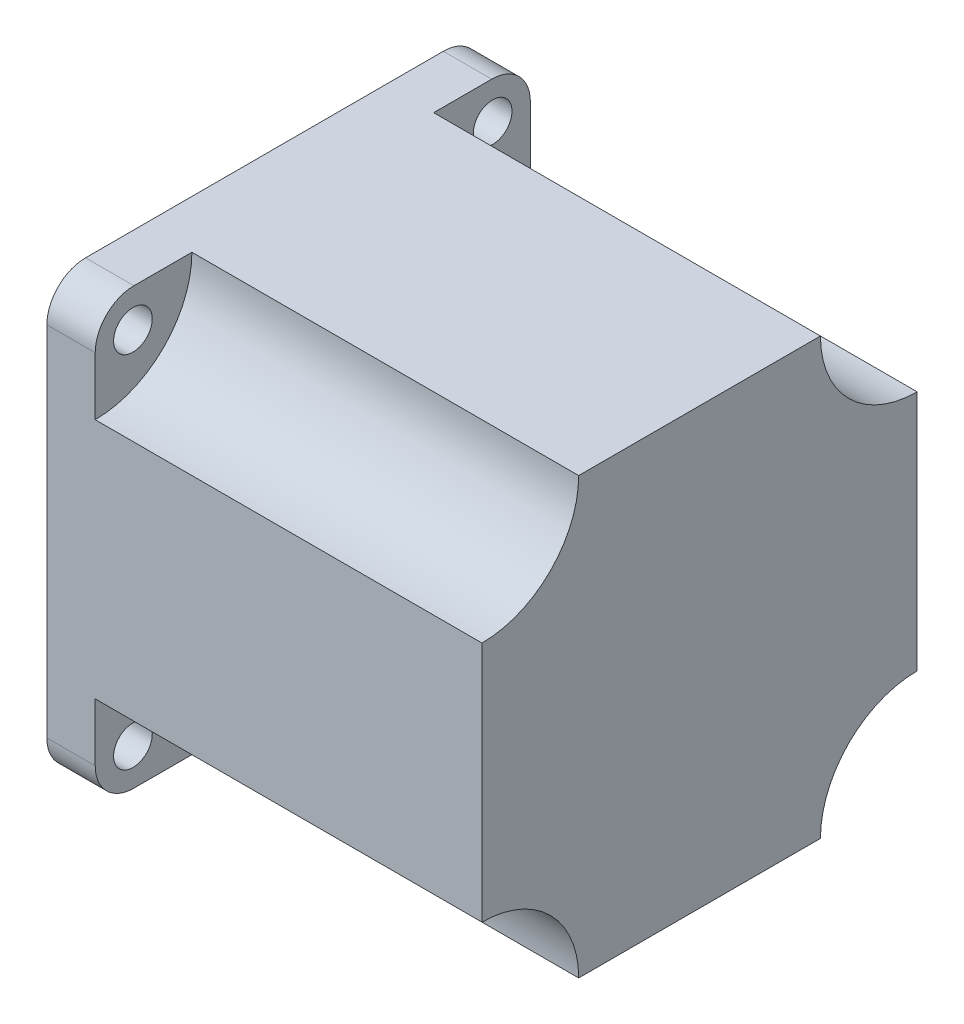
ISO-10303-21;
HEADER;
FILE_DESCRIPTION(('STEP AP214'),'2;1');
FILE_NAME('part.step','',(''),(''),'','','');
FILE_SCHEMA(('AUTOMOTIVE_DESIGN { 1 0 10303 214 1 1 1 1 }'));
ENDSEC;
DATA;
#1=APPLICATION_CONTEXT('core data for automotive mechanical design processes');
#2=APPLICATION_PROTOCOL_DEFINITION('international standard','automotive_design',2000,#1);
#3=PRODUCT_CONTEXT('',#1,'mechanical');
#4=PRODUCT('Part','Part','',(#3));
#5=PRODUCT_RELATED_PRODUCT_CATEGORY('part','',(#4));
#6=PRODUCT_DEFINITION_FORMATION('','',#4);
#7=PRODUCT_DEFINITION_CONTEXT('part definition',#1,'design');
#8=PRODUCT_DEFINITION('design','',#6,#7);
#9=PRODUCT_DEFINITION_SHAPE('','',#8);
#10=(LENGTH_UNIT() NAMED_UNIT(*) SI_UNIT(.MILLI.,.METRE.));
#11=(NAMED_UNIT(*) PLANE_ANGLE_UNIT() SI_UNIT($,.RADIAN.));
#12=(NAMED_UNIT(*) SI_UNIT($,.STERADIAN.) SOLID_ANGLE_UNIT());
#13=UNCERTAINTY_MEASURE_WITH_UNIT(LENGTH_MEASURE(1.E-05),#10,'distance_accuracy_value','');
#14=(GEOMETRIC_REPRESENTATION_CONTEXT(3) GLOBAL_UNCERTAINTY_ASSIGNED_CONTEXT((#13)) GLOBAL_UNIT_ASSIGNED_CONTEXT((#10,
#11,#12)) REPRESENTATION_CONTEXT('',''));
#15=CARTESIAN_POINT('',(0.,0.,0.));
#16=DIRECTION('',(0.,0.,1.));
#17=DIRECTION('',(1.,0.,0.));
#18=AXIS2_PLACEMENT_3D('',#15,#16,#17);
#19=CARTESIAN_POINT('',(6.35,0.,0.));
#20=DIRECTION('',(-1.,0.,0.));
#21=DIRECTION('',(0.,0.,1.));
#22=AXIS2_PLACEMENT_3D('',#19,#20,#21);
#23=PLANE('',#22);
#24=CARTESIAN_POINT('',(6.35,23.622,23.622));
#25=DIRECTION('',(1.,0.,0.));
#26=DIRECTION('',(0.,0.,-1.));
#27=AXIS2_PLACEMENT_3D('',#24,#25,#26);
#28=CIRCLE('',#27,2.54);
#29=CARTESIAN_POINT('',(6.35,23.622,21.082));
#30=VERTEX_POINT('',#29);
#31=EDGE_CURVE('E322',#30,#30,#28,.T.);
#32=ORIENTED_EDGE('',*,*,#31,.F.);
#33=EDGE_LOOP('',(#32));
#34=FACE_BOUND('',#33,.T.);
#35=DIRECTION('',(0.,-1.,0.));
#36=VECTOR('',#35,1.);
#37=CARTESIAN_POINT('',(6.35,28.575,28.575));
#38=LINE('',#37,#36);
#39=CARTESIAN_POINT('',(6.35,23.495,28.575));
#40=VERTEX_POINT('',#39);
#41=CARTESIAN_POINT('',(6.35,15.875,28.575));
#42=VERTEX_POINT('',#41);
#43=EDGE_CURVE('E273',#40,#42,#38,.T.);
#44=ORIENTED_EDGE('',*,*,#43,.T.);
#45=CARTESIAN_POINT('',(6.35,28.575,28.575));
#46=DIRECTION('',(1.,0.,0.));
#47=DIRECTION('',(0.,0.,-1.));
#48=AXIS2_PLACEMENT_3D('',#45,#46,#47);
#49=CIRCLE('',#48,12.7);
#50=CARTESIAN_POINT('',(6.35,28.575,15.875));
#51=VERTEX_POINT('',#50);
#52=EDGE_CURVE('E164',#42,#51,#49,.T.);
#53=ORIENTED_EDGE('',*,*,#52,.T.);
#54=DIRECTION('',(0.,0.,1.));
#55=VECTOR('',#54,1.);
#56=CARTESIAN_POINT('',(6.35,28.575,-28.575));
#57=LINE('',#56,#55);
#58=CARTESIAN_POINT('',(6.35,28.575,23.495));
#59=VERTEX_POINT('',#58);
#60=EDGE_CURVE('E66',#51,#59,#57,.T.);
#61=ORIENTED_EDGE('',*,*,#60,.T.);
#62=CARTESIAN_POINT('',(6.35,23.495,23.495));
#63=DIRECTION('',(-1.,0.,0.));
#64=DIRECTION('',(0.,0.,1.));
#65=AXIS2_PLACEMENT_3D('',#62,#63,#64);
#66=CIRCLE('',#65,5.08);
#67=EDGE_CURVE('E628',#59,#40,#66,.F.);
#68=ORIENTED_EDGE('',*,*,#67,.T.);
#69=EDGE_LOOP('',(#44,#53,#61,#68));
#70=FACE_BOUND('',#69,.T.);
#71=ADVANCED_FACE('F41',(#34,#70),#23,.F.);
#72=CARTESIAN_POINT('',(6.35,23.622,-23.622));
#73=DIRECTION('',(1.,0.,0.));
#74=DIRECTION('',(0.,0.,-1.));
#75=AXIS2_PLACEMENT_3D('',#72,#73,#74);
#76=CIRCLE('',#75,2.54);
#77=CARTESIAN_POINT('',(6.35,23.622,-26.162));
#78=VERTEX_POINT('',#77);
#79=EDGE_CURVE('E328',#78,#78,#76,.T.);
#80=ORIENTED_EDGE('',*,*,#79,.F.);
#81=EDGE_LOOP('',(#80));
#82=FACE_BOUND('',#81,.T.);
#83=CARTESIAN_POINT('',(6.35,28.575,-23.495));
#84=VERTEX_POINT('',#83);
#85=CARTESIAN_POINT('',(6.35,28.575,-15.875));
#86=VERTEX_POINT('',#85);
#87=EDGE_CURVE('E293',#84,#86,#57,.T.);
#88=ORIENTED_EDGE('',*,*,#87,.T.);
#89=CARTESIAN_POINT('',(6.35,28.575,-28.575));
#90=DIRECTION('',(1.,0.,0.));
#91=DIRECTION('',(0.,0.,-1.));
#92=AXIS2_PLACEMENT_3D('',#89,#90,#91);
#93=CIRCLE('',#92,12.7);
#94=CARTESIAN_POINT('',(6.35,15.875,-28.575));
#95=VERTEX_POINT('',#94);
#96=EDGE_CURVE('E210',#86,#95,#93,.T.);
#97=ORIENTED_EDGE('',*,*,#96,.T.);
#98=DIRECTION('',(0.,1.,0.));
#99=VECTOR('',#98,1.);
#100=CARTESIAN_POINT('',(6.35,28.575,-28.575));
#101=LINE('',#100,#99);
#102=CARTESIAN_POINT('',(6.35,23.495,-28.575));
#103=VERTEX_POINT('',#102);
#104=EDGE_CURVE('E277',#95,#103,#101,.T.);
#105=ORIENTED_EDGE('',*,*,#104,.T.);
#106=CARTESIAN_POINT('',(6.35,23.495,-23.495));
#107=DIRECTION('',(-1.,0.,0.));
#108=DIRECTION('',(0.,0.,1.));
#109=AXIS2_PLACEMENT_3D('',#106,#107,#108);
#110=CIRCLE('',#109,5.08);
#111=EDGE_CURVE('E615',#103,#84,#110,.F.);
#112=ORIENTED_EDGE('',*,*,#111,.T.);
#113=EDGE_LOOP('',(#88,#97,#105,#112));
#114=FACE_BOUND('',#113,.T.);
#115=ADVANCED_FACE('F355',(#82,#114),#23,.F.);
#116=CARTESIAN_POINT('',(6.35,-23.622,-23.622));
#117=DIRECTION('',(1.,0.,0.));
#118=DIRECTION('',(0.,0.,-1.));
#119=AXIS2_PLACEMENT_3D('',#116,#117,#118);
#120=CIRCLE('',#119,2.54);
#121=CARTESIAN_POINT('',(6.35,-23.622,-26.162));
#122=VERTEX_POINT('',#121);
#123=EDGE_CURVE('E302',#122,#122,#120,.T.);
#124=ORIENTED_EDGE('',*,*,#123,.F.);
#125=EDGE_LOOP('',(#124));
#126=FACE_BOUND('',#125,.T.);
#127=CARTESIAN_POINT('',(6.35,-23.495,-28.575));
#128=VERTEX_POINT('',#127);
#129=CARTESIAN_POINT('',(6.35,-15.875,-28.575));
#130=VERTEX_POINT('',#129);
#131=EDGE_CURVE('E265',#128,#130,#101,.T.);
#132=ORIENTED_EDGE('',*,*,#131,.T.);
#133=CARTESIAN_POINT('',(6.35,-28.575,-28.575));
#134=DIRECTION('',(1.,0.,0.));
#135=DIRECTION('',(0.,0.,-1.));
#136=AXIS2_PLACEMENT_3D('',#133,#134,#135);
#137=CIRCLE('',#136,12.7);
#138=CARTESIAN_POINT('',(6.35,-28.575,-15.875));
#139=VERTEX_POINT('',#138);
#140=EDGE_CURVE('E186',#130,#139,#137,.T.);
#141=ORIENTED_EDGE('',*,*,#140,.T.);
#142=DIRECTION('',(0.,0.,-1.));
#143=VECTOR('',#142,1.);
#144=CARTESIAN_POINT('',(6.35,-28.575,-28.575));
#145=LINE('',#144,#143);
#146=CARTESIAN_POINT('',(6.35,-28.575,-23.495));
#147=VERTEX_POINT('',#146);
#148=EDGE_CURVE('E262',#139,#147,#145,.T.);
#149=ORIENTED_EDGE('',*,*,#148,.T.);
#150=CARTESIAN_POINT('',(6.35,-23.495,-23.495));
#151=DIRECTION('',(-1.,0.,0.));
#152=DIRECTION('',(0.,0.,1.));
#153=AXIS2_PLACEMENT_3D('',#150,#151,#152);
#154=CIRCLE('',#153,5.08);
#155=EDGE_CURVE('E607',#147,#128,#154,.F.);
#156=ORIENTED_EDGE('',*,*,#155,.T.);
#157=EDGE_LOOP('',(#132,#141,#149,#156));
#158=FACE_BOUND('',#157,.T.);
#159=ADVANCED_FACE('F261',(#126,#158),#23,.F.);
#160=CARTESIAN_POINT('',(-1.524,0.,0.));
#161=DIRECTION('',(-1.,0.,0.));
#162=DIRECTION('',(0.,0.,1.));
#163=AXIS2_PLACEMENT_3D('',#160,#161,#162);
#164=PLANE('',#163);
#165=CARTESIAN_POINT('',(-1.524,0.,0.));
#166=DIRECTION('',(-1.,0.,0.));
#167=DIRECTION('',(0.,0.,1.));
#168=AXIS2_PLACEMENT_3D('',#165,#166,#167);
#169=CIRCLE('',#168,19.05);
#170=CARTESIAN_POINT('',(-1.524,0.,-19.05));
#171=VERTEX_POINT('',#170);
#172=EDGE_CURVE('E313',#171,#171,#169,.T.);
#173=ORIENTED_EDGE('',*,*,#172,.T.);
#174=EDGE_LOOP('',(#173));
#175=FACE_BOUND('',#174,.T.);
#176=CARTESIAN_POINT('',(-1.524,0.,0.));
#177=DIRECTION('',(-1.,0.,0.));
#178=DIRECTION('',(0.,0.,1.));
#179=AXIS2_PLACEMENT_3D('',#176,#177,#178);
#180=CIRCLE('',#179,3.175);
#181=CARTESIAN_POINT('',(-1.524,0.,-3.175));
#182=VERTEX_POINT('',#181);
#183=EDGE_CURVE('E246',#182,#182,#180,.T.);
#184=ORIENTED_EDGE('',*,*,#183,.F.);
#185=EDGE_LOOP('',(#184));
#186=FACE_BOUND('',#185,.T.);
#187=ADVANCED_FACE('F371',(#175,#186),#164,.T.);
#188=CARTESIAN_POINT('',(0.,0.,0.));
#189=DIRECTION('',(-1.,0.,0.));
#190=DIRECTION('',(0.,0.,1.));
#191=AXIS2_PLACEMENT_3D('',#188,#189,#190);
#192=PLANE('',#191);
#193=CARTESIAN_POINT('',(0.,-23.622,-23.622));
#194=DIRECTION('',(1.,0.,0.));
#195=DIRECTION('',(0.,0.,-1.));
#196=AXIS2_PLACEMENT_3D('',#193,#194,#195);
#197=CIRCLE('',#196,2.54);
#198=CARTESIAN_POINT('',(0.,-23.622,-26.162));
#199=VERTEX_POINT('',#198);
#200=EDGE_CURVE('E305',#199,#199,#197,.T.);
#201=ORIENTED_EDGE('',*,*,#200,.T.);
#202=EDGE_LOOP('',(#201));
#203=FACE_BOUND('',#202,.T.);
#204=CARTESIAN_POINT('',(0.,23.622,23.622));
#205=DIRECTION('',(1.,0.,0.));
#206=DIRECTION('',(0.,0.,-1.));
#207=AXIS2_PLACEMENT_3D('',#204,#205,#206);
#208=CIRCLE('',#207,2.54);
#209=CARTESIAN_POINT('',(0.,23.622,21.082));
#210=VERTEX_POINT('',#209);
#211=EDGE_CURVE('E320',#210,#210,#208,.T.);
#212=ORIENTED_EDGE('',*,*,#211,.T.);
#213=EDGE_LOOP('',(#212));
#214=FACE_BOUND('',#213,.T.);
#215=DIRECTION('',(0.,1.,0.));
#216=VECTOR('',#215,1.);
#217=CARTESIAN_POINT('',(0.,28.575,-28.575));
#218=LINE('',#217,#216);
#219=CARTESIAN_POINT('',(0.,-23.495,-28.575));
#220=VERTEX_POINT('',#219);
#221=CARTESIAN_POINT('',(0.,23.495,-28.575));
#222=VERTEX_POINT('',#221);
#223=EDGE_CURVE('E647',#220,#222,#218,.T.);
#224=ORIENTED_EDGE('',*,*,#223,.F.);
#225=CARTESIAN_POINT('',(0.,-23.495,-23.495));
#226=DIRECTION('',(-1.,0.,0.));
#227=DIRECTION('',(0.,0.,1.));
#228=AXIS2_PLACEMENT_3D('',#225,#226,#227);
#229=CIRCLE('',#228,5.08);
#230=CARTESIAN_POINT('',(0.,-28.575,-23.495));
#231=VERTEX_POINT('',#230);
#232=EDGE_CURVE('E635',#220,#231,#229,.T.);
#233=ORIENTED_EDGE('',*,*,#232,.T.);
#234=DIRECTION('',(0.,0.,-1.));
#235=VECTOR('',#234,1.);
#236=CARTESIAN_POINT('',(0.,-28.575,-28.575));
#237=LINE('',#236,#235);
#238=CARTESIAN_POINT('',(0.,-28.575,23.495));
#239=VERTEX_POINT('',#238);
#240=EDGE_CURVE('E650',#239,#231,#237,.T.);
#241=ORIENTED_EDGE('',*,*,#240,.F.);
#242=CARTESIAN_POINT('',(0.,-23.495,23.495));
#243=DIRECTION('',(-1.,0.,0.));
#244=DIRECTION('',(0.,0.,1.));
#245=AXIS2_PLACEMENT_3D('',#242,#243,#244);
#246=CIRCLE('',#245,5.08);
#247=CARTESIAN_POINT('',(0.,-23.495,28.575));
#248=VERTEX_POINT('',#247);
#249=EDGE_CURVE('E637',#239,#248,#246,.T.);
#250=ORIENTED_EDGE('',*,*,#249,.T.);
#251=DIRECTION('',(0.,-1.,0.));
#252=VECTOR('',#251,1.);
#253=CARTESIAN_POINT('',(0.,28.575,28.575));
#254=LINE('',#253,#252);
#255=CARTESIAN_POINT('',(0.,23.495,28.575));
#256=VERTEX_POINT('',#255);
#257=EDGE_CURVE('E330',#256,#248,#254,.T.);
#258=ORIENTED_EDGE('',*,*,#257,.F.);
#259=CARTESIAN_POINT('',(0.,23.495,23.495));
#260=DIRECTION('',(-1.,0.,0.));
#261=DIRECTION('',(0.,0.,1.));
#262=AXIS2_PLACEMENT_3D('',#259,#260,#261);
#263=CIRCLE('',#262,5.08);
#264=CARTESIAN_POINT('',(0.,28.575,23.495));
#265=VERTEX_POINT('',#264);
#266=EDGE_CURVE('E641',#256,#265,#263,.T.);
#267=ORIENTED_EDGE('',*,*,#266,.T.);
#268=DIRECTION('',(0.,0.,1.));
#269=VECTOR('',#268,1.);
#270=CARTESIAN_POINT('',(0.,28.575,-28.575));
#271=LINE('',#270,#269);
#272=CARTESIAN_POINT('',(0.,28.575,-23.495));
#273=VERTEX_POINT('',#272);
#274=EDGE_CURVE('E626',#273,#265,#271,.T.);
#275=ORIENTED_EDGE('',*,*,#274,.F.);
#276=CARTESIAN_POINT('',(0.,23.495,-23.495));
#277=DIRECTION('',(-1.,0.,0.));
#278=DIRECTION('',(0.,0.,1.));
#279=AXIS2_PLACEMENT_3D('',#276,#277,#278);
#280=CIRCLE('',#279,5.08);
#281=EDGE_CURVE('E639',#273,#222,#280,.T.);
#282=ORIENTED_EDGE('',*,*,#281,.T.);
#283=EDGE_LOOP('',(#224,#233,#241,#250,#258,#267,#275,#282));
#284=FACE_BOUND('',#283,.T.);
#285=CARTESIAN_POINT('',(0.,23.622,-23.622));
#286=DIRECTION('',(1.,0.,0.));
#287=DIRECTION('',(0.,0.,-1.));
#288=AXIS2_PLACEMENT_3D('',#285,#286,#287);
#289=CIRCLE('',#288,2.54);
#290=CARTESIAN_POINT('',(0.,23.622,-26.162));
#291=VERTEX_POINT('',#290);
#292=EDGE_CURVE('E325',#291,#291,#289,.T.);
#293=ORIENTED_EDGE('',*,*,#292,.T.);
#294=EDGE_LOOP('',(#293));
#295=FACE_BOUND('',#294,.T.);
#296=CARTESIAN_POINT('',(0.,-23.622,23.622));
#297=DIRECTION('',(1.,0.,0.));
#298=DIRECTION('',(0.,0.,-1.));
#299=AXIS2_PLACEMENT_3D('',#296,#297,#298);
#300=CIRCLE('',#299,2.54);
#301=CARTESIAN_POINT('',(0.,-23.622,21.082));
#302=VERTEX_POINT('',#301);
#303=EDGE_CURVE('E304',#302,#302,#300,.T.);
#304=ORIENTED_EDGE('',*,*,#303,.T.);
#305=EDGE_LOOP('',(#304));
#306=FACE_BOUND('',#305,.T.);
#307=CARTESIAN_POINT('',(0.,0.,0.));
#308=DIRECTION('',(-1.,0.,0.));
#309=DIRECTION('',(0.,0.,1.));
#310=AXIS2_PLACEMENT_3D('',#307,#308,#309);
#311=CIRCLE('',#310,19.05);
#312=CARTESIAN_POINT('',(0.,0.,-19.05));
#313=VERTEX_POINT('',#312);
#314=EDGE_CURVE('E316',#313,#313,#311,.T.);
#315=ORIENTED_EDGE('',*,*,#314,.F.);
#316=EDGE_LOOP('',(#315));
#317=FACE_BOUND('',#316,.T.);
#318=ADVANCED_FACE('F334',(#203,#214,#284,#295,#306,#317),#192,.T.);
#319=CARTESIAN_POINT('',(6.35,-23.622,23.622));
#320=DIRECTION('',(1.,0.,0.));
#321=DIRECTION('',(0.,0.,-1.));
#322=AXIS2_PLACEMENT_3D('',#319,#320,#321);
#323=CIRCLE('',#322,2.54);
#324=CARTESIAN_POINT('',(6.35,-23.622,21.082));
#325=VERTEX_POINT('',#324);
#326=EDGE_CURVE('E310',#325,#325,#323,.T.);
#327=ORIENTED_EDGE('',*,*,#326,.F.);
#328=EDGE_LOOP('',(#327));
#329=FACE_BOUND('',#328,.T.);
#330=CARTESIAN_POINT('',(6.35,-28.575,23.495));
#331=VERTEX_POINT('',#330);
#332=CARTESIAN_POINT('',(6.35,-28.575,15.875));
#333=VERTEX_POINT('',#332);
#334=EDGE_CURVE('E272',#331,#333,#145,.T.);
#335=ORIENTED_EDGE('',*,*,#334,.T.);
#336=CARTESIAN_POINT('',(6.35,-28.575,28.575));
#337=DIRECTION('',(1.,0.,0.));
#338=DIRECTION('',(0.,0.,-1.));
#339=AXIS2_PLACEMENT_3D('',#336,#337,#338);
#340=CIRCLE('',#339,12.7);
#341=CARTESIAN_POINT('',(6.35,-15.875,28.575));
#342=VERTEX_POINT('',#341);
#343=EDGE_CURVE('E184',#333,#342,#340,.T.);
#344=ORIENTED_EDGE('',*,*,#343,.T.);
#345=CARTESIAN_POINT('',(6.35,-23.495,28.575));
#346=VERTEX_POINT('',#345);
#347=EDGE_CURVE('E242',#342,#346,#38,.T.);
#348=ORIENTED_EDGE('',*,*,#347,.T.);
#349=CARTESIAN_POINT('',(6.35,-23.495,23.495));
#350=DIRECTION('',(-1.,0.,0.));
#351=DIRECTION('',(0.,0.,1.));
#352=AXIS2_PLACEMENT_3D('',#349,#350,#351);
#353=CIRCLE('',#352,5.08);
#354=EDGE_CURVE('E610',#346,#331,#353,.F.);
#355=ORIENTED_EDGE('',*,*,#354,.T.);
#356=EDGE_LOOP('',(#335,#344,#348,#355));
#357=FACE_BOUND('',#356,.T.);
#358=ADVANCED_FACE('F357',(#329,#357),#23,.F.);
#359=CARTESIAN_POINT('',(6.35,28.575,28.575));
#360=DIRECTION('',(0.,0.,-1.));
#361=DIRECTION('',(0.,1.,0.));
#362=AXIS2_PLACEMENT_3D('',#359,#360,#361);
#363=PLANE('',#362);
#364=ORIENTED_EDGE('',*,*,#257,.T.);
#365=DIRECTION('',(-1.,0.,0.));
#366=VECTOR('',#365,1.);
#367=CARTESIAN_POINT('',(6.35,-23.495,28.575));
#368=LINE('',#367,#366);
#369=EDGE_CURVE('E613',#248,#346,#368,.F.);
#370=ORIENTED_EDGE('',*,*,#369,.T.);
#371=ORIENTED_EDGE('',*,*,#347,.F.);
#372=DIRECTION('',(-1.,0.,0.));
#373=VECTOR('',#372,1.);
#374=CARTESIAN_POINT('',(57.15,-15.875,28.575));
#375=LINE('',#374,#373);
#376=CARTESIAN_POINT('',(57.15,-15.875,28.575));
#377=VERTEX_POINT('',#376);
#378=EDGE_CURVE('E58',#377,#342,#375,.T.);
#379=ORIENTED_EDGE('',*,*,#378,.F.);
#380=DIRECTION('',(0.,1.,0.));
#381=VECTOR('',#380,1.);
#382=CARTESIAN_POINT('',(57.15,-15.875,28.575));
#383=LINE('',#382,#381);
#384=CARTESIAN_POINT('',(57.15,15.875,28.575));
#385=VERTEX_POINT('',#384);
#386=EDGE_CURVE('E176',#377,#385,#383,.T.);
#387=ORIENTED_EDGE('',*,*,#386,.T.);
#388=DIRECTION('',(-1.,0.,0.));
#389=VECTOR('',#388,1.);
#390=CARTESIAN_POINT('',(57.15,15.875,28.575));
#391=LINE('',#390,#389);
#392=EDGE_CURVE('E160',#385,#42,#391,.T.);
#393=ORIENTED_EDGE('',*,*,#392,.T.);
#394=ORIENTED_EDGE('',*,*,#43,.F.);
#395=DIRECTION('',(-1.,0.,0.));
#396=VECTOR('',#395,1.);
#397=CARTESIAN_POINT('',(6.35,23.495,28.575));
#398=LINE('',#397,#396);
#399=EDGE_CURVE('E609',#40,#256,#398,.T.);
#400=ORIENTED_EDGE('',*,*,#399,.T.);
#401=EDGE_LOOP('',(#364,#370,#371,#379,#387,#393,#394,#400));
#402=FACE_BOUND('',#401,.T.);
#403=ADVANCED_FACE('F182',(#402),#363,.F.);
#404=CARTESIAN_POINT('',(6.35,-28.575,-28.575));
#405=DIRECTION('',(0.,1.,0.));
#406=DIRECTION('',(0.,0.,1.));
#407=AXIS2_PLACEMENT_3D('',#404,#405,#406);
#408=PLANE('',#407);
#409=ORIENTED_EDGE('',*,*,#240,.T.);
#410=DIRECTION('',(-1.,0.,0.));
#411=VECTOR('',#410,1.);
#412=CARTESIAN_POINT('',(6.35,-28.575,-23.495));
#413=LINE('',#412,#411);
#414=EDGE_CURVE('E269',#231,#147,#413,.F.);
#415=ORIENTED_EDGE('',*,*,#414,.T.);
#416=ORIENTED_EDGE('',*,*,#148,.F.);
#417=DIRECTION('',(-1.,0.,0.));
#418=VECTOR('',#417,1.);
#419=CARTESIAN_POINT('',(57.15,-28.575,-15.875));
#420=LINE('',#419,#418);
#421=CARTESIAN_POINT('',(57.15,-28.575,-15.875));
#422=VERTEX_POINT('',#421);
#423=EDGE_CURVE('E229',#422,#139,#420,.T.);
#424=ORIENTED_EDGE('',*,*,#423,.F.);
#425=DIRECTION('',(0.,0.,1.));
#426=VECTOR('',#425,1.);
#427=CARTESIAN_POINT('',(57.15,-28.575,-15.875));
#428=LINE('',#427,#426);
#429=CARTESIAN_POINT('',(57.15,-28.575,15.875));
#430=VERTEX_POINT('',#429);
#431=EDGE_CURVE('E200',#422,#430,#428,.T.);
#432=ORIENTED_EDGE('',*,*,#431,.T.);
#433=DIRECTION('',(-1.,0.,0.));
#434=VECTOR('',#433,1.);
#435=CARTESIAN_POINT('',(57.15,-28.575,15.875));
#436=LINE('',#435,#434);
#437=EDGE_CURVE('E247',#430,#333,#436,.T.);
#438=ORIENTED_EDGE('',*,*,#437,.T.);
#439=ORIENTED_EDGE('',*,*,#334,.F.);
#440=DIRECTION('',(-1.,0.,0.));
#441=VECTOR('',#440,1.);
#442=CARTESIAN_POINT('',(6.35,-28.575,23.495));
#443=LINE('',#442,#441);
#444=EDGE_CURVE('E630',#331,#239,#443,.T.);
#445=ORIENTED_EDGE('',*,*,#444,.T.);
#446=EDGE_LOOP('',(#409,#415,#416,#424,#432,#438,#439,#445));
#447=FACE_BOUND('',#446,.T.);
#448=ADVANCED_FACE('F267',(#447),#408,.F.);
#449=CARTESIAN_POINT('',(6.35,28.575,-28.575));
#450=DIRECTION('',(0.,0.,1.));
#451=DIRECTION('',(0.,-1.,0.));
#452=AXIS2_PLACEMENT_3D('',#449,#450,#451);
#453=PLANE('',#452);
#454=ORIENTED_EDGE('',*,*,#131,.F.);
#455=DIRECTION('',(-1.,0.,0.));
#456=VECTOR('',#455,1.);
#457=CARTESIAN_POINT('',(6.35,-23.495,-28.575));
#458=LINE('',#457,#456);
#459=EDGE_CURVE('E300',#128,#220,#458,.T.);
#460=ORIENTED_EDGE('',*,*,#459,.T.);
#461=ORIENTED_EDGE('',*,*,#223,.T.);
#462=DIRECTION('',(-1.,0.,0.));
#463=VECTOR('',#462,1.);
#464=CARTESIAN_POINT('',(6.35,23.495,-28.575));
#465=LINE('',#464,#463);
#466=EDGE_CURVE('E296',#222,#103,#465,.F.);
#467=ORIENTED_EDGE('',*,*,#466,.T.);
#468=ORIENTED_EDGE('',*,*,#104,.F.);
#469=DIRECTION('',(-1.,0.,0.));
#470=VECTOR('',#469,1.);
#471=CARTESIAN_POINT('',(57.15,15.875,-28.575));
#472=LINE('',#471,#470);
#473=CARTESIAN_POINT('',(57.15,15.875,-28.575));
#474=VERTEX_POINT('',#473);
#475=EDGE_CURVE('E218',#474,#95,#472,.T.);
#476=ORIENTED_EDGE('',*,*,#475,.F.);
#477=DIRECTION('',(0.,-1.,0.));
#478=VECTOR('',#477,1.);
#479=CARTESIAN_POINT('',(57.15,15.875,-28.575));
#480=LINE('',#479,#478);
#481=CARTESIAN_POINT('',(57.15,-15.875,-28.575));
#482=VERTEX_POINT('',#481);
#483=EDGE_CURVE('E194',#474,#482,#480,.T.);
#484=ORIENTED_EDGE('',*,*,#483,.T.);
#485=DIRECTION('',(-1.,0.,0.));
#486=VECTOR('',#485,1.);
#487=CARTESIAN_POINT('',(57.15,-15.875,-28.575));
#488=LINE('',#487,#486);
#489=EDGE_CURVE('E224',#482,#130,#488,.T.);
#490=ORIENTED_EDGE('',*,*,#489,.T.);
#491=EDGE_LOOP('',(#454,#460,#461,#467,#468,#476,#484,#490));
#492=FACE_BOUND('',#491,.T.);
#493=ADVANCED_FACE('F350',(#492),#453,.F.);
#494=CARTESIAN_POINT('',(6.35,28.575,-28.575));
#495=DIRECTION('',(0.,-1.,0.));
#496=DIRECTION('',(0.,0.,-1.));
#497=AXIS2_PLACEMENT_3D('',#494,#495,#496);
#498=PLANE('',#497);
#499=ORIENTED_EDGE('',*,*,#87,.F.);
#500=DIRECTION('',(-1.,0.,0.));
#501=VECTOR('',#500,1.);
#502=CARTESIAN_POINT('',(6.35,28.575,-23.495));
#503=LINE('',#502,#501);
#504=EDGE_CURVE('E11',#84,#273,#503,.T.);
#505=ORIENTED_EDGE('',*,*,#504,.T.);
#506=ORIENTED_EDGE('',*,*,#274,.T.);
#507=DIRECTION('',(-1.,0.,0.));
#508=VECTOR('',#507,1.);
#509=CARTESIAN_POINT('',(6.35,28.575,23.495));
#510=LINE('',#509,#508);
#511=EDGE_CURVE('E50',#265,#59,#510,.F.);
#512=ORIENTED_EDGE('',*,*,#511,.T.);
#513=ORIENTED_EDGE('',*,*,#60,.F.);
#514=DIRECTION('',(-1.,0.,0.));
#515=VECTOR('',#514,1.);
#516=CARTESIAN_POINT('',(57.15,28.575,15.875));
#517=LINE('',#516,#515);
#518=CARTESIAN_POINT('',(57.15,28.575,15.875));
#519=VERTEX_POINT('',#518);
#520=EDGE_CURVE('E169',#519,#51,#517,.T.);
#521=ORIENTED_EDGE('',*,*,#520,.F.);
#522=DIRECTION('',(0.,0.,-1.));
#523=VECTOR('',#522,1.);
#524=CARTESIAN_POINT('',(57.15,28.575,15.875));
#525=LINE('',#524,#523);
#526=CARTESIAN_POINT('',(57.15,28.575,-15.875));
#527=VERTEX_POINT('',#526);
#528=EDGE_CURVE('E179',#519,#527,#525,.T.);
#529=ORIENTED_EDGE('',*,*,#528,.T.);
#530=DIRECTION('',(-1.,0.,0.));
#531=VECTOR('',#530,1.);
#532=CARTESIAN_POINT('',(57.15,28.575,-15.875));
#533=LINE('',#532,#531);
#534=EDGE_CURVE('E214',#527,#86,#533,.T.);
#535=ORIENTED_EDGE('',*,*,#534,.T.);
#536=EDGE_LOOP('',(#499,#505,#506,#512,#513,#521,#529,#535));
#537=FACE_BOUND('',#536,.T.);
#538=ADVANCED_FACE('F340',(#537),#498,.F.);
#539=CARTESIAN_POINT('',(6.35,23.622,-23.622));
#540=DIRECTION('',(-1.,0.,0.));
#541=DIRECTION('',(0.,0.,1.));
#542=AXIS2_PLACEMENT_3D('',#539,#540,#541);
#543=CYLINDRICAL_SURFACE('',#542,2.54);
#544=ORIENTED_EDGE('',*,*,#79,.T.);
#545=EDGE_LOOP('',(#544));
#546=FACE_BOUND('',#545,.T.);
#547=ORIENTED_EDGE('',*,*,#292,.F.);
#548=EDGE_LOOP('',(#547));
#549=FACE_BOUND('',#548,.T.);
#550=ADVANCED_FACE('F337',(#546,#549),#543,.F.);
#551=CARTESIAN_POINT('',(6.35,23.622,23.622));
#552=DIRECTION('',(-1.,0.,0.));
#553=DIRECTION('',(0.,0.,1.));
#554=AXIS2_PLACEMENT_3D('',#551,#552,#553);
#555=CYLINDRICAL_SURFACE('',#554,2.54);
#556=ORIENTED_EDGE('',*,*,#31,.T.);
#557=EDGE_LOOP('',(#556));
#558=FACE_BOUND('',#557,.T.);
#559=ORIENTED_EDGE('',*,*,#211,.F.);
#560=EDGE_LOOP('',(#559));
#561=FACE_BOUND('',#560,.T.);
#562=ADVANCED_FACE('F339',(#558,#561),#555,.F.);
#563=CARTESIAN_POINT('',(6.35,-23.622,23.622));
#564=DIRECTION('',(-1.,0.,0.));
#565=DIRECTION('',(0.,0.,1.));
#566=AXIS2_PLACEMENT_3D('',#563,#564,#565);
#567=CYLINDRICAL_SURFACE('',#566,2.54);
#568=ORIENTED_EDGE('',*,*,#326,.T.);
#569=EDGE_LOOP('',(#568));
#570=FACE_BOUND('',#569,.T.);
#571=ORIENTED_EDGE('',*,*,#303,.F.);
#572=EDGE_LOOP('',(#571));
#573=FACE_BOUND('',#572,.T.);
#574=ADVANCED_FACE('F347',(#570,#573),#567,.F.);
#575=CARTESIAN_POINT('',(6.35,-23.622,-23.622));
#576=DIRECTION('',(-1.,0.,0.));
#577=DIRECTION('',(0.,0.,1.));
#578=AXIS2_PLACEMENT_3D('',#575,#576,#577);
#579=CYLINDRICAL_SURFACE('',#578,2.54);
#580=ORIENTED_EDGE('',*,*,#123,.T.);
#581=EDGE_LOOP('',(#580));
#582=FACE_BOUND('',#581,.T.);
#583=ORIENTED_EDGE('',*,*,#200,.F.);
#584=EDGE_LOOP('',(#583));
#585=FACE_BOUND('',#584,.T.);
#586=ADVANCED_FACE('F394',(#582,#585),#579,.F.);
#587=CARTESIAN_POINT('',(6.35,-23.495,-23.495));
#588=DIRECTION('',(-1.,0.,0.));
#589=DIRECTION('',(0.,0.,1.));
#590=AXIS2_PLACEMENT_3D('',#587,#588,#589);
#591=CYLINDRICAL_SURFACE('',#590,5.08);
#592=ORIENTED_EDGE('',*,*,#155,.F.);
#593=ORIENTED_EDGE('',*,*,#414,.F.);
#594=ORIENTED_EDGE('',*,*,#232,.F.);
#595=ORIENTED_EDGE('',*,*,#459,.F.);
#596=EDGE_LOOP('',(#592,#593,#594,#595));
#597=FACE_BOUND('',#596,.T.);
#598=ADVANCED_FACE('F397',(#597),#591,.T.);
#599=CARTESIAN_POINT('',(6.35,-23.495,23.495));
#600=DIRECTION('',(-1.,0.,0.));
#601=DIRECTION('',(0.,0.,1.));
#602=AXIS2_PLACEMENT_3D('',#599,#600,#601);
#603=CYLINDRICAL_SURFACE('',#602,5.08);
#604=ORIENTED_EDGE('',*,*,#354,.F.);
#605=ORIENTED_EDGE('',*,*,#369,.F.);
#606=ORIENTED_EDGE('',*,*,#249,.F.);
#607=ORIENTED_EDGE('',*,*,#444,.F.);
#608=EDGE_LOOP('',(#604,#605,#606,#607));
#609=FACE_BOUND('',#608,.T.);
#610=ADVANCED_FACE('F556',(#609),#603,.T.);
#611=CARTESIAN_POINT('',(6.35,23.495,-23.495));
#612=DIRECTION('',(-1.,0.,0.));
#613=DIRECTION('',(0.,0.,1.));
#614=AXIS2_PLACEMENT_3D('',#611,#612,#613);
#615=CYLINDRICAL_SURFACE('',#614,5.08);
#616=ORIENTED_EDGE('',*,*,#111,.F.);
#617=ORIENTED_EDGE('',*,*,#466,.F.);
#618=ORIENTED_EDGE('',*,*,#281,.F.);
#619=ORIENTED_EDGE('',*,*,#504,.F.);
#620=EDGE_LOOP('',(#616,#617,#618,#619));
#621=FACE_BOUND('',#620,.T.);
#622=ADVANCED_FACE('F547',(#621),#615,.T.);
#623=CARTESIAN_POINT('',(6.35,23.495,23.495));
#624=DIRECTION('',(-1.,0.,0.));
#625=DIRECTION('',(0.,0.,1.));
#626=AXIS2_PLACEMENT_3D('',#623,#624,#625);
#627=CYLINDRICAL_SURFACE('',#626,5.08);
#628=ORIENTED_EDGE('',*,*,#67,.F.);
#629=ORIENTED_EDGE('',*,*,#511,.F.);
#630=ORIENTED_EDGE('',*,*,#266,.F.);
#631=ORIENTED_EDGE('',*,*,#399,.F.);
#632=EDGE_LOOP('',(#628,#629,#630,#631));
#633=FACE_BOUND('',#632,.T.);
#634=ADVANCED_FACE('F43',(#633),#627,.T.);
#635=CARTESIAN_POINT('',(-1.524,0.,0.));
#636=DIRECTION('',(1.,0.,0.));
#637=DIRECTION('',(0.,0.,-1.));
#638=AXIS2_PLACEMENT_3D('',#635,#636,#637);
#639=CYLINDRICAL_SURFACE('',#638,19.05);
#640=CARTESIAN_POINT('',(-1.524,0.,-19.05));
#641=CARTESIAN_POINT('',(-1.508125,0.,-19.05));
#642=CARTESIAN_POINT('',(-1.49225,0.,-19.05));
#643=CARTESIAN_POINT('',(-1.4605,0.,-19.05));
#644=CARTESIAN_POINT('',(-1.444625,0.,-19.05));
#645=CARTESIAN_POINT('',(-1.412875,0.,-19.05));
#646=CARTESIAN_POINT('',(-1.397,0.,-19.05));
#647=CARTESIAN_POINT('',(-1.36525,0.,-19.05));
#648=CARTESIAN_POINT('',(-1.349375,0.,-19.05));
#649=CARTESIAN_POINT('',(-1.317625,0.,-19.05));
#650=CARTESIAN_POINT('',(-1.30175,0.,-19.05));
#651=CARTESIAN_POINT('',(-1.27,0.,-19.05));
#652=CARTESIAN_POINT('',(-1.254125,0.,-19.05));
#653=CARTESIAN_POINT('',(-1.222375,0.,-19.05));
#654=CARTESIAN_POINT('',(-1.2065,0.,-19.05));
#655=CARTESIAN_POINT('',(-1.17475,0.,-19.05));
#656=CARTESIAN_POINT('',(-1.158875,0.,-19.05));
#657=CARTESIAN_POINT('',(-1.127125,0.,-19.05));
#658=CARTESIAN_POINT('',(-1.11125,0.,-19.05));
#659=CARTESIAN_POINT('',(-1.0795,0.,-19.05));
#660=CARTESIAN_POINT('',(-1.063625,0.,-19.05));
#661=CARTESIAN_POINT('',(-1.031875,0.,-19.05));
#662=CARTESIAN_POINT('',(-1.016,0.,-19.05));
#663=CARTESIAN_POINT('',(-0.98425,0.,-19.05));
#664=CARTESIAN_POINT('',(-0.968375,0.,-19.05));
#665=CARTESIAN_POINT('',(-0.936625,0.,-19.05));
#666=CARTESIAN_POINT('',(-0.92075,0.,-19.05));
#667=CARTESIAN_POINT('',(-0.889,0.,-19.05));
#668=CARTESIAN_POINT('',(-0.873125,0.,-19.05));
#669=CARTESIAN_POINT('',(-0.841375,0.,-19.05));
#670=CARTESIAN_POINT('',(-0.8255,0.,-19.05));
#671=CARTESIAN_POINT('',(-0.79375,0.,-19.05));
#672=CARTESIAN_POINT('',(-0.777875,0.,-19.05));
#673=CARTESIAN_POINT('',(-0.746125,0.,-19.05));
#674=CARTESIAN_POINT('',(-0.73025,0.,-19.05));
#675=CARTESIAN_POINT('',(-0.6985,0.,-19.05));
#676=CARTESIAN_POINT('',(-0.682625,0.,-19.05));
#677=CARTESIAN_POINT('',(-0.650875,0.,-19.05));
#678=CARTESIAN_POINT('',(-0.635,0.,-19.05));
#679=CARTESIAN_POINT('',(-0.60325,0.,-19.05));
#680=CARTESIAN_POINT('',(-0.587375,0.,-19.05));
#681=CARTESIAN_POINT('',(-0.555625,0.,-19.05));
#682=CARTESIAN_POINT('',(-0.53975,0.,-19.05));
#683=CARTESIAN_POINT('',(-0.508,0.,-19.05));
#684=CARTESIAN_POINT('',(-0.492125,0.,-19.05));
#685=CARTESIAN_POINT('',(-0.460375,0.,-19.05));
#686=CARTESIAN_POINT('',(-0.4445,0.,-19.05));
#687=CARTESIAN_POINT('',(-0.41275,0.,-19.05));
#688=CARTESIAN_POINT('',(-0.396875,0.,-19.05));
#689=CARTESIAN_POINT('',(-0.365125,0.,-19.05));
#690=CARTESIAN_POINT('',(-0.34925,0.,-19.05));
#691=CARTESIAN_POINT('',(-0.3175,0.,-19.05));
#692=CARTESIAN_POINT('',(-0.301625,0.,-19.05));
#693=CARTESIAN_POINT('',(-0.269875,0.,-19.05));
#694=CARTESIAN_POINT('',(-0.254,0.,-19.05));
#695=CARTESIAN_POINT('',(-0.22225,0.,-19.05));
#696=CARTESIAN_POINT('',(-0.206375,0.,-19.05));
#697=CARTESIAN_POINT('',(-0.174625,0.,-19.05));
#698=CARTESIAN_POINT('',(-0.15875,0.,-19.05));
#699=CARTESIAN_POINT('',(-0.127,0.,-19.05));
#700=CARTESIAN_POINT('',(-0.111125,0.,-19.05));
#701=CARTESIAN_POINT('',(-0.079375,0.,-19.05));
#702=CARTESIAN_POINT('',(-0.0635,0.,-19.05));
#703=CARTESIAN_POINT('',(-0.0317499999999999,0.,-19.05));
#704=CARTESIAN_POINT('',(-0.015875,0.,-19.05));
#705=CARTESIAN_POINT('',(0.,0.,-19.05));
#706=B_SPLINE_CURVE_WITH_KNOTS('',3,(#640,#641,#642,#643,#644,#645,#646,#647,#648,#649,#650,
#651,#652,#653,#654,#655,#656,#657,#658,#659,#660,#661,#662,#663,#664,#665,#666,#667,#668,#669,
#670,#671,#672,#673,#674,#675,#676,#677,#678,#679,#680,#681,#682,#683,#684,#685,#686,#687,#688,
#689,#690,#691,#692,#693,#694,#695,#696,#697,#698,#699,#700,#701,#702,#703,#704,#705),
.UNSPECIFIED.,.F.,.F.,(4,2,2,2,2,2,2,2,2,2,2,2,2,2,2,2,2,2,2,2,2,2,2,2,2,2,2,2,2,2,2,2,4),(0.,
0.0476249999999999,0.0952499999999998,0.142875,0.1905,0.238125,0.28575,0.333375,0.381,0.428625,
0.47625,0.523875,0.5715,0.619125,0.66675,0.714375,0.762,0.809625,0.85725,0.904875,0.9525,
1.000125,1.04775,1.095375,1.143,1.190625,1.23825,1.285875,1.3335,1.381125,1.42875,1.476375,
1.524),.UNSPECIFIED.);
#707=EDGE_CURVE('BSEAM390',#171,#313,#706,.T.);
#708=ORIENTED_EDGE('',*,*,#172,.F.);
#709=ORIENTED_EDGE('',*,*,#314,.T.);
#710=ORIENTED_EDGE('',*,*,#707,.T.);
#711=ORIENTED_EDGE('',*,*,#707,.F.);
#712=EDGE_LOOP('',(#708,#710,#709,#711));
#713=FACE_BOUND('',#712,.T.);
#714=ADVANCED_FACE('F390',(#713),#639,.T.);
#715=CARTESIAN_POINT('',(-20.574,0.,0.));
#716=DIRECTION('',(1.,0.,0.));
#717=DIRECTION('',(0.,0.,-1.));
#718=AXIS2_PLACEMENT_3D('',#715,#716,#717);
#719=CYLINDRICAL_SURFACE('',#718,3.175);
#720=CARTESIAN_POINT('',(-20.574,0.,0.));
#721=DIRECTION('',(-1.,0.,0.));
#722=DIRECTION('',(0.,0.,1.));
#723=AXIS2_PLACEMENT_3D('',#720,#721,#722);
#724=CIRCLE('',#723,3.175);
#725=CARTESIAN_POINT('',(-20.574,0.,-3.175));
#726=VERTEX_POINT('',#725);
#727=EDGE_CURVE('E238',#726,#726,#724,.T.);
#728=CARTESIAN_POINT('',(-20.574,0.,-3.175));
#729=CARTESIAN_POINT('',(-20.3755625,0.,-3.175));
#730=CARTESIAN_POINT('',(-20.177125,0.,-3.175));
#731=CARTESIAN_POINT('',(-19.78025,0.,-3.175));
#732=CARTESIAN_POINT('',(-19.5818125,0.,-3.175));
#733=CARTESIAN_POINT('',(-19.1849375,0.,-3.175));
#734=CARTESIAN_POINT('',(-18.9865,0.,-3.175));
#735=CARTESIAN_POINT('',(-18.589625,0.,-3.175));
#736=CARTESIAN_POINT('',(-18.3911875,0.,-3.175));
#737=CARTESIAN_POINT('',(-17.9943125,0.,-3.175));
#738=CARTESIAN_POINT('',(-17.795875,0.,-3.175));
#739=CARTESIAN_POINT('',(-17.399,0.,-3.175));
#740=CARTESIAN_POINT('',(-17.2005625,0.,-3.175));
#741=CARTESIAN_POINT('',(-16.8036875,0.,-3.175));
#742=CARTESIAN_POINT('',(-16.60525,0.,-3.175));
#743=CARTESIAN_POINT('',(-16.208375,0.,-3.175));
#744=CARTESIAN_POINT('',(-16.0099375,0.,-3.175));
#745=CARTESIAN_POINT('',(-15.6130625,0.,-3.175));
#746=CARTESIAN_POINT('',(-15.414625,0.,-3.175));
#747=CARTESIAN_POINT('',(-15.01775,0.,-3.175));
#748=CARTESIAN_POINT('',(-14.8193125,0.,-3.175));
#749=CARTESIAN_POINT('',(-14.4224375,0.,-3.175));
#750=CARTESIAN_POINT('',(-14.224,0.,-3.175));
#751=CARTESIAN_POINT('',(-13.827125,0.,-3.175));
#752=CARTESIAN_POINT('',(-13.6286875,0.,-3.175));
#753=CARTESIAN_POINT('',(-13.2318125,0.,-3.175));
#754=CARTESIAN_POINT('',(-13.033375,0.,-3.175));
#755=CARTESIAN_POINT('',(-12.6365,0.,-3.175));
#756=CARTESIAN_POINT('',(-12.4380625,0.,-3.175));
#757=CARTESIAN_POINT('',(-12.0411875,0.,-3.175));
#758=CARTESIAN_POINT('',(-11.84275,0.,-3.175));
#759=CARTESIAN_POINT('',(-11.445875,0.,-3.175));
#760=CARTESIAN_POINT('',(-11.2474375,0.,-3.175));
#761=CARTESIAN_POINT('',(-10.8505625,0.,-3.175));
#762=CARTESIAN_POINT('',(-10.652125,0.,-3.175));
#763=CARTESIAN_POINT('',(-10.25525,0.,-3.175));
#764=CARTESIAN_POINT('',(-10.0568125,0.,-3.175));
#765=CARTESIAN_POINT('',(-9.6599375,0.,-3.175));
#766=CARTESIAN_POINT('',(-9.4615,0.,-3.175));
#767=CARTESIAN_POINT('',(-9.064625,0.,-3.175));
#768=CARTESIAN_POINT('',(-8.8661875,0.,-3.175));
#769=CARTESIAN_POINT('',(-8.4693125,0.,-3.175));
#770=CARTESIAN_POINT('',(-8.270875,0.,-3.175));
#771=CARTESIAN_POINT('',(-7.874,0.,-3.175));
#772=CARTESIAN_POINT('',(-7.6755625,0.,-3.175));
#773=CARTESIAN_POINT('',(-7.2786875,0.,-3.175));
#774=CARTESIAN_POINT('',(-7.08025,0.,-3.175));
#775=CARTESIAN_POINT('',(-6.683375,0.,-3.175));
#776=CARTESIAN_POINT('',(-6.4849375,0.,-3.175));
#777=CARTESIAN_POINT('',(-6.0880625,0.,-3.175));
#778=CARTESIAN_POINT('',(-5.889625,0.,-3.175));
#779=CARTESIAN_POINT('',(-5.49275,0.,-3.175));
#780=CARTESIAN_POINT('',(-5.2943125,0.,-3.175));
#781=CARTESIAN_POINT('',(-4.8974375,0.,-3.175));
#782=CARTESIAN_POINT('',(-4.699,0.,-3.175));
#783=CARTESIAN_POINT('',(-4.302125,0.,-3.175));
#784=CARTESIAN_POINT('',(-4.1036875,0.,-3.175));
#785=CARTESIAN_POINT('',(-3.7068125,0.,-3.175));
#786=CARTESIAN_POINT('',(-3.508375,0.,-3.175));
#787=CARTESIAN_POINT('',(-3.1115,0.,-3.175));
#788=CARTESIAN_POINT('',(-2.9130625,0.,-3.175));
#789=CARTESIAN_POINT('',(-2.5161875,0.,-3.175));
#790=CARTESIAN_POINT('',(-2.31775,0.,-3.175));
#791=CARTESIAN_POINT('',(-1.920875,0.,-3.175));
#792=CARTESIAN_POINT('',(-1.7224375,0.,-3.175));
#793=CARTESIAN_POINT('',(-1.524,0.,-3.175));
#794=B_SPLINE_CURVE_WITH_KNOTS('',3,(#728,#729,#730,#731,#732,#733,#734,#735,#736,#737,#738,
#739,#740,#741,#742,#743,#744,#745,#746,#747,#748,#749,#750,#751,#752,#753,#754,#755,#756,#757,
#758,#759,#760,#761,#762,#763,#764,#765,#766,#767,#768,#769,#770,#771,#772,#773,#774,#775,#776,
#777,#778,#779,#780,#781,#782,#783,#784,#785,#786,#787,#788,#789,#790,#791,#792,#793),
.UNSPECIFIED.,.F.,.F.,(4,2,2,2,2,2,2,2,2,2,2,2,2,2,2,2,2,2,2,2,2,2,2,2,2,2,2,2,2,2,2,2,4),(0.,
0.595312499999997,1.190625,1.7859375,2.38125,2.9765625,3.571875,4.1671875,4.7625,5.3578125,
5.953125,6.5484375,7.14375,7.7390625,8.334375,8.9296875,9.525,10.1203125,10.715625,11.3109375,
11.90625,12.5015625,13.096875,13.6921875,14.2875,14.8828125,15.478125,16.0734375,16.66875,
17.2640625,17.859375,18.4546875,19.05),.UNSPECIFIED.);
#795=EDGE_CURVE('BSEAM388',#726,#182,#794,.T.);
#796=ORIENTED_EDGE('',*,*,#727,.F.);
#797=ORIENTED_EDGE('',*,*,#183,.T.);
#798=ORIENTED_EDGE('',*,*,#795,.T.);
#799=ORIENTED_EDGE('',*,*,#795,.F.);
#800=EDGE_LOOP('',(#796,#798,#797,#799));
#801=FACE_BOUND('',#800,.T.);
#802=ADVANCED_FACE('F388',(#801),#719,.T.);
#803=CARTESIAN_POINT('',(-20.574,0.,0.));
#804=DIRECTION('',(-1.,0.,0.));
#805=DIRECTION('',(0.,0.,1.));
#806=AXIS2_PLACEMENT_3D('',#803,#804,#805);
#807=PLANE('',#806);
#808=ORIENTED_EDGE('',*,*,#727,.T.);
#809=EDGE_LOOP('',(#808));
#810=FACE_BOUND('',#809,.T.);
#811=ADVANCED_FACE('F415',(#810),#807,.T.);
#812=CARTESIAN_POINT('',(57.15,-28.575,28.575));
#813=DIRECTION('',(-1.,0.,0.));
#814=DIRECTION('',(0.,0.,1.));
#815=AXIS2_PLACEMENT_3D('',#812,#813,#814);
#816=CYLINDRICAL_SURFACE('',#815,12.7);
#817=ORIENTED_EDGE('',*,*,#343,.F.);
#818=ORIENTED_EDGE('',*,*,#437,.F.);
#819=CARTESIAN_POINT('',(57.15,-28.575,28.575));
#820=DIRECTION('',(1.,0.,0.));
#821=DIRECTION('',(0.,0.,-1.));
#822=AXIS2_PLACEMENT_3D('',#819,#820,#821);
#823=CIRCLE('',#822,12.7);
#824=EDGE_CURVE('E170',#430,#377,#823,.T.);
#825=ORIENTED_EDGE('',*,*,#824,.T.);
#826=ORIENTED_EDGE('',*,*,#378,.T.);
#827=EDGE_LOOP('',(#817,#818,#825,#826));
#828=FACE_BOUND('',#827,.T.);
#829=ADVANCED_FACE('F420',(#828),#816,.F.);
#830=CARTESIAN_POINT('',(57.15,-28.575,-28.575));
#831=DIRECTION('',(-1.,0.,0.));
#832=DIRECTION('',(0.,0.,1.));
#833=AXIS2_PLACEMENT_3D('',#830,#831,#832);
#834=CYLINDRICAL_SURFACE('',#833,12.7);
#835=ORIENTED_EDGE('',*,*,#140,.F.);
#836=ORIENTED_EDGE('',*,*,#489,.F.);
#837=CARTESIAN_POINT('',(57.15,-28.575,-28.575));
#838=DIRECTION('',(1.,0.,0.));
#839=DIRECTION('',(0.,0.,-1.));
#840=AXIS2_PLACEMENT_3D('',#837,#838,#839);
#841=CIRCLE('',#840,12.7);
#842=EDGE_CURVE('E197',#482,#422,#841,.T.);
#843=ORIENTED_EDGE('',*,*,#842,.T.);
#844=ORIENTED_EDGE('',*,*,#423,.T.);
#845=EDGE_LOOP('',(#835,#836,#843,#844));
#846=FACE_BOUND('',#845,.T.);
#847=ADVANCED_FACE('F254',(#846),#834,.F.);
#848=CARTESIAN_POINT('',(57.15,28.575,-28.575));
#849=DIRECTION('',(-1.,0.,0.));
#850=DIRECTION('',(0.,0.,1.));
#851=AXIS2_PLACEMENT_3D('',#848,#849,#850);
#852=CYLINDRICAL_SURFACE('',#851,12.7);
#853=ORIENTED_EDGE('',*,*,#96,.F.);
#854=ORIENTED_EDGE('',*,*,#534,.F.);
#855=CARTESIAN_POINT('',(57.15,28.575,-28.575));
#856=DIRECTION('',(1.,0.,0.));
#857=DIRECTION('',(0.,0.,-1.));
#858=AXIS2_PLACEMENT_3D('',#855,#856,#857);
#859=CIRCLE('',#858,12.7);
#860=EDGE_CURVE('E190',#527,#474,#859,.T.);
#861=ORIENTED_EDGE('',*,*,#860,.T.);
#862=ORIENTED_EDGE('',*,*,#475,.T.);
#863=EDGE_LOOP('',(#853,#854,#861,#862));
#864=FACE_BOUND('',#863,.T.);
#865=ADVANCED_FACE('F428',(#864),#852,.F.);
#866=CARTESIAN_POINT('',(57.15,28.575,28.575));
#867=DIRECTION('',(-1.,0.,0.));
#868=DIRECTION('',(0.,0.,1.));
#869=AXIS2_PLACEMENT_3D('',#866,#867,#868);
#870=CYLINDRICAL_SURFACE('',#869,12.7);
#871=ORIENTED_EDGE('',*,*,#52,.F.);
#872=ORIENTED_EDGE('',*,*,#392,.F.);
#873=CARTESIAN_POINT('',(57.15,28.575,28.575));
#874=DIRECTION('',(1.,0.,0.));
#875=DIRECTION('',(0.,0.,-1.));
#876=AXIS2_PLACEMENT_3D('',#873,#874,#875);
#877=CIRCLE('',#876,12.7);
#878=EDGE_CURVE('E163',#385,#519,#877,.T.);
#879=ORIENTED_EDGE('',*,*,#878,.T.);
#880=ORIENTED_EDGE('',*,*,#520,.T.);
#881=EDGE_LOOP('',(#871,#872,#879,#880));
#882=FACE_BOUND('',#881,.T.);
#883=ADVANCED_FACE('F162',(#882),#870,.F.);
#884=CARTESIAN_POINT('',(57.15,28.575,28.575));
#885=DIRECTION('',(1.,0.,0.));
#886=DIRECTION('',(0.,0.,-1.));
#887=AXIS2_PLACEMENT_3D('',#884,#885,#886);
#888=PLANE('',#887);
#889=ORIENTED_EDGE('',*,*,#386,.F.);
#890=ORIENTED_EDGE('',*,*,#824,.F.);
#891=ORIENTED_EDGE('',*,*,#431,.F.);
#892=ORIENTED_EDGE('',*,*,#842,.F.);
#893=ORIENTED_EDGE('',*,*,#483,.F.);
#894=ORIENTED_EDGE('',*,*,#860,.F.);
#895=ORIENTED_EDGE('',*,*,#528,.F.);
#896=ORIENTED_EDGE('',*,*,#878,.F.);
#897=EDGE_LOOP('',(#889,#890,#891,#892,#893,#894,#895,#896));
#898=FACE_BOUND('',#897,.T.);
#899=ADVANCED_FACE('F174',(#898),#888,.T.);
#900=CLOSED_SHELL('',(#71,#115,#159,#187,#318,#358,#403,#448,#493,#538,#550,#562,#574,#586,#598,
#610,#622,#634,#714,#802,#811,#829,#847,#865,#883,#899));
#901=MANIFOLD_SOLID_BREP('B2',#900);
#902=ADVANCED_BREP_SHAPE_REPRESENTATION('',(#18,#901),#14);
#903=SHAPE_DEFINITION_REPRESENTATION(#9,#902);
ENDSEC;
END-ISO-10303-21;
